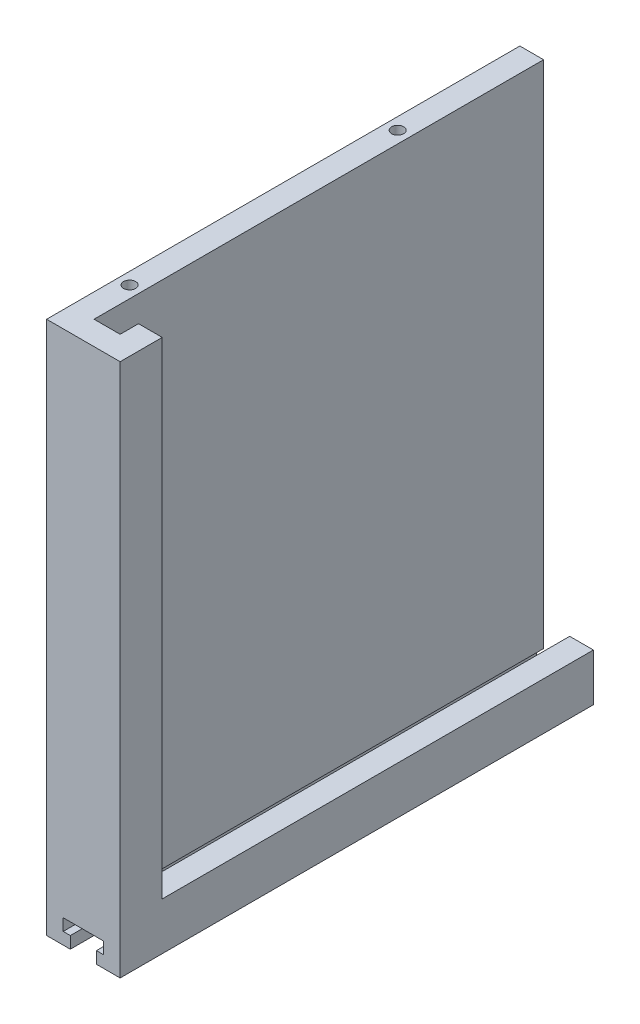
ISO-10303-21;
HEADER;
FILE_DESCRIPTION(('STEP AP214'),'2;1');
FILE_NAME('part.step','',(''),(''),'','','');
FILE_SCHEMA(('AUTOMOTIVE_DESIGN { 1 0 10303 214 1 1 1 1 }'));
ENDSEC;
DATA;
#1=APPLICATION_CONTEXT('core data for automotive mechanical design processes');
#2=APPLICATION_PROTOCOL_DEFINITION('international standard','automotive_design',2000,#1);
#3=PRODUCT_CONTEXT('',#1,'mechanical');
#4=PRODUCT('Part','Part','',(#3));
#5=PRODUCT_RELATED_PRODUCT_CATEGORY('part','',(#4));
#6=PRODUCT_DEFINITION_FORMATION('','',#4);
#7=PRODUCT_DEFINITION_CONTEXT('part definition',#1,'design');
#8=PRODUCT_DEFINITION('design','',#6,#7);
#9=PRODUCT_DEFINITION_SHAPE('','',#8);
#10=(LENGTH_UNIT() NAMED_UNIT(*) SI_UNIT(.MILLI.,.METRE.));
#11=(NAMED_UNIT(*) PLANE_ANGLE_UNIT() SI_UNIT($,.RADIAN.));
#12=(NAMED_UNIT(*) SI_UNIT($,.STERADIAN.) SOLID_ANGLE_UNIT());
#13=UNCERTAINTY_MEASURE_WITH_UNIT(LENGTH_MEASURE(1.E-05),#10,'distance_accuracy_value','');
#14=(GEOMETRIC_REPRESENTATION_CONTEXT(3) GLOBAL_UNCERTAINTY_ASSIGNED_CONTEXT((#13)) GLOBAL_UNIT_ASSIGNED_CONTEXT((#10,
#11,#12)) REPRESENTATION_CONTEXT('',''));
#15=CARTESIAN_POINT('',(0.,0.,0.));
#16=DIRECTION('',(0.,0.,1.));
#17=DIRECTION('',(1.,0.,0.));
#18=AXIS2_PLACEMENT_3D('',#15,#16,#17);
#19=CARTESIAN_POINT('',(10.,-225.,-199.5));
#20=DIRECTION('',(0.,1.,0.));
#21=DIRECTION('',(0.,0.,1.));
#22=AXIS2_PLACEMENT_3D('',#19,#20,#21);
#23=PLANE('',#22);
#24=DIRECTION('',(0.,0.,-1.));
#25=VECTOR('',#24,1.);
#26=CARTESIAN_POINT('',(0.,-225.,-199.5));
#27=LINE('',#26,#25);
#28=CARTESIAN_POINT('',(0.,-225.,199.5));
#29=VERTEX_POINT('',#28);
#30=CARTESIAN_POINT('',(0.,-225.,0.));
#31=VERTEX_POINT('',#30);
#32=EDGE_CURVE('E204',#29,#31,#27,.T.);
#33=ORIENTED_EDGE('',*,*,#32,.T.);
#34=DIRECTION('',(1.,0.,0.));
#35=VECTOR('',#34,1.);
#36=CARTESIAN_POINT('',(0.,-225.,0.));
#37=LINE('',#36,#35);
#38=CARTESIAN_POINT('',(10.,-225.,0.));
#39=VERTEX_POINT('',#38);
#40=EDGE_CURVE('E169',#31,#39,#37,.T.);
#41=ORIENTED_EDGE('',*,*,#40,.T.);
#42=DIRECTION('',(0.,0.,1.));
#43=VECTOR('',#42,1.);
#44=CARTESIAN_POINT('',(10.,-225.,-189.5));
#45=LINE('',#44,#43);
#46=CARTESIAN_POINT('',(10.,-225.,199.5));
#47=VERTEX_POINT('',#46);
#48=EDGE_CURVE('E241',#39,#47,#45,.T.);
#49=ORIENTED_EDGE('',*,*,#48,.T.);
#50=DIRECTION('',(-1.,0.,0.));
#51=VECTOR('',#50,1.);
#52=CARTESIAN_POINT('',(10.,-225.,199.5));
#53=LINE('',#52,#51);
#54=EDGE_CURVE('E207',#47,#29,#53,.T.);
#55=ORIENTED_EDGE('',*,*,#54,.T.);
#56=EDGE_LOOP('',(#33,#41,#49,#55));
#57=FACE_BOUND('',#56,.T.);
#58=ADVANCED_FACE('F38',(#57),#23,.F.);
#59=CARTESIAN_POINT('',(0.,0.,-199.51));
#60=DIRECTION('',(0.,-1.,0.));
#61=DIRECTION('',(0.,0.,-1.));
#62=AXIS2_PLACEMENT_3D('',#59,#60,#61);
#63=PLANE('',#62);
#64=CARTESIAN_POINT('',(5.,0.,169.5));
#65=DIRECTION('',(0.,1.,0.));
#66=DIRECTION('',(0.,0.,1.));
#67=AXIS2_PLACEMENT_3D('',#64,#65,#66);
#68=CIRCLE('',#67,2.55);
#69=CARTESIAN_POINT('',(5.,0.,172.05));
#70=VERTEX_POINT('',#69);
#71=EDGE_CURVE('E287',#70,#70,#68,.T.);
#72=ORIENTED_EDGE('',*,*,#71,.F.);
#73=EDGE_LOOP('',(#72));
#74=FACE_BOUND('',#73,.T.);
#75=CARTESIAN_POINT('',(4.99999999999998,0.,56.5));
#76=DIRECTION('',(0.,1.,0.));
#77=DIRECTION('',(0.,0.,1.));
#78=AXIS2_PLACEMENT_3D('',#75,#76,#77);
#79=CIRCLE('',#78,2.55);
#80=CARTESIAN_POINT('',(4.99999999999998,0.,59.05));
#81=VERTEX_POINT('',#80);
#82=EDGE_CURVE('E284',#81,#81,#79,.T.);
#83=ORIENTED_EDGE('',*,*,#82,.F.);
#84=EDGE_LOOP('',(#83));
#85=FACE_BOUND('',#84,.T.);
#86=DIRECTION('',(0.,0.,1.));
#87=VECTOR('',#86,1.);
#88=CARTESIAN_POINT('',(10.,0.,0.));
#89=LINE('',#88,#87);
#90=CARTESIAN_POINT('',(10.,0.,0.));
#91=VERTEX_POINT('',#90);
#92=CARTESIAN_POINT('',(10.,0.,189.5));
#93=VERTEX_POINT('',#92);
#94=EDGE_CURVE('E210',#91,#93,#89,.T.);
#95=ORIENTED_EDGE('',*,*,#94,.F.);
#96=DIRECTION('',(-1.,0.,0.));
#97=VECTOR('',#96,1.);
#98=CARTESIAN_POINT('',(0.,0.,0.));
#99=LINE('',#98,#97);
#100=CARTESIAN_POINT('',(0.,0.,0.));
#101=VERTEX_POINT('',#100);
#102=EDGE_CURVE('E168',#91,#101,#99,.T.);
#103=ORIENTED_EDGE('',*,*,#102,.T.);
#104=DIRECTION('',(0.,0.,1.));
#105=VECTOR('',#104,1.);
#106=CARTESIAN_POINT('',(0.,0.,0.));
#107=LINE('',#106,#105);
#108=CARTESIAN_POINT('',(0.,0.,199.5));
#109=VERTEX_POINT('',#108);
#110=EDGE_CURVE('E214',#101,#109,#107,.T.);
#111=ORIENTED_EDGE('',*,*,#110,.T.);
#112=DIRECTION('',(-1.,0.,0.));
#113=VECTOR('',#112,1.);
#114=CARTESIAN_POINT('',(10.,0.,199.5));
#115=LINE('',#114,#113);
#116=CARTESIAN_POINT('',(31.,0.,199.5));
#117=VERTEX_POINT('',#116);
#118=EDGE_CURVE('E213',#117,#109,#115,.T.);
#119=ORIENTED_EDGE('',*,*,#118,.F.);
#120=DIRECTION('',(0.,0.,1.));
#121=VECTOR('',#120,1.);
#122=CARTESIAN_POINT('',(31.,0.,0.));
#123=LINE('',#122,#121);
#124=CARTESIAN_POINT('',(31.,0.,181.766666666667));
#125=VERTEX_POINT('',#124);
#126=EDGE_CURVE('E211',#125,#117,#123,.T.);
#127=ORIENTED_EDGE('',*,*,#126,.F.);
#128=DIRECTION('',(-1.,0.,0.));
#129=VECTOR('',#128,1.);
#130=CARTESIAN_POINT('',(31.,0.,181.766666666667));
#131=LINE('',#130,#129);
#132=CARTESIAN_POINT('',(21.,0.,181.766666666667));
#133=VERTEX_POINT('',#132);
#134=EDGE_CURVE('E222',#125,#133,#131,.T.);
#135=ORIENTED_EDGE('',*,*,#134,.T.);
#136=DIRECTION('',(0.,0.,1.));
#137=VECTOR('',#136,1.);
#138=CARTESIAN_POINT('',(21.,0.,0.));
#139=LINE('',#138,#137);
#140=CARTESIAN_POINT('',(21.,0.,189.5));
#141=VERTEX_POINT('',#140);
#142=EDGE_CURVE('E216',#133,#141,#139,.T.);
#143=ORIENTED_EDGE('',*,*,#142,.T.);
#144=DIRECTION('',(-1.,0.,0.));
#145=VECTOR('',#144,1.);
#146=CARTESIAN_POINT('',(21.,0.,189.5));
#147=LINE('',#146,#145);
#148=EDGE_CURVE('E46',#141,#93,#147,.T.);
#149=ORIENTED_EDGE('',*,*,#148,.T.);
#150=EDGE_LOOP('',(#95,#103,#111,#119,#127,#135,#143,#149));
#151=FACE_BOUND('',#150,.T.);
#152=ADVANCED_FACE('F40',(#74,#85,#151),#63,.F.);
#153=CARTESIAN_POINT('',(10.,-225.,199.5));
#154=DIRECTION('',(0.,0.,-1.));
#155=DIRECTION('',(-1.,0.,0.));
#156=AXIS2_PLACEMENT_3D('',#153,#154,#155);
#157=PLANE('',#156);
#158=DIRECTION('',(0.,-1.,0.));
#159=VECTOR('',#158,1.);
#160=CARTESIAN_POINT('',(31.,-225.,199.5));
#161=LINE('',#160,#159);
#162=CARTESIAN_POINT('',(31.,-225.,199.5));
#163=VERTEX_POINT('',#162);
#164=EDGE_CURVE('E182',#117,#163,#161,.T.);
#165=ORIENTED_EDGE('',*,*,#164,.F.);
#166=ORIENTED_EDGE('',*,*,#118,.T.);
#167=DIRECTION('',(0.,-1.,0.));
#168=VECTOR('',#167,1.);
#169=CARTESIAN_POINT('',(0.,-225.,199.5));
#170=LINE('',#169,#168);
#171=EDGE_CURVE('E202',#109,#29,#170,.T.);
#172=ORIENTED_EDGE('',*,*,#171,.T.);
#173=ORIENTED_EDGE('',*,*,#54,.F.);
#174=DIRECTION('',(0.,1.,0.));
#175=VECTOR('',#174,1.);
#176=CARTESIAN_POINT('',(9.99999999999992,0.,199.5));
#177=LINE('',#176,#175);
#178=CARTESIAN_POINT('',(10.,-220.,199.5));
#179=VERTEX_POINT('',#178);
#180=EDGE_CURVE('E254',#47,#179,#177,.T.);
#181=ORIENTED_EDGE('',*,*,#180,.T.);
#182=DIRECTION('',(-1.,0.,0.));
#183=VECTOR('',#182,1.);
#184=CARTESIAN_POINT('',(0.,-220.,199.5));
#185=LINE('',#184,#183);
#186=CARTESIAN_POINT('',(7.,-220.,199.5));
#187=VERTEX_POINT('',#186);
#188=EDGE_CURVE('E267',#179,#187,#185,.T.);
#189=ORIENTED_EDGE('',*,*,#188,.T.);
#190=DIRECTION('',(0.,1.,0.));
#191=VECTOR('',#190,1.);
#192=CARTESIAN_POINT('',(6.99999999999996,0.,199.5));
#193=LINE('',#192,#191);
#194=CARTESIAN_POINT('',(7.,-215.,199.5));
#195=VERTEX_POINT('',#194);
#196=EDGE_CURVE('E268',#187,#195,#193,.T.);
#197=ORIENTED_EDGE('',*,*,#196,.T.);
#198=DIRECTION('',(-1.,0.,0.));
#199=VECTOR('',#198,1.);
#200=CARTESIAN_POINT('',(0.,-215.,199.5));
#201=LINE('',#200,#199);
#202=CARTESIAN_POINT('',(24.,-215.,199.5));
#203=VERTEX_POINT('',#202);
#204=EDGE_CURVE('E271',#203,#195,#201,.T.);
#205=ORIENTED_EDGE('',*,*,#204,.F.);
#206=DIRECTION('',(0.,1.,0.));
#207=VECTOR('',#206,1.);
#208=CARTESIAN_POINT('',(24.,0.,199.5));
#209=LINE('',#208,#207);
#210=CARTESIAN_POINT('',(24.,-220.,199.5));
#211=VERTEX_POINT('',#210);
#212=EDGE_CURVE('E274',#211,#203,#209,.T.);
#213=ORIENTED_EDGE('',*,*,#212,.F.);
#214=CARTESIAN_POINT('',(21.,-220.,199.5));
#215=VERTEX_POINT('',#214);
#216=EDGE_CURVE('E277',#211,#215,#185,.T.);
#217=ORIENTED_EDGE('',*,*,#216,.T.);
#218=DIRECTION('',(0.,1.,0.));
#219=VECTOR('',#218,1.);
#220=CARTESIAN_POINT('',(21.,0.,199.5));
#221=LINE('',#220,#219);
#222=CARTESIAN_POINT('',(21.,-225.,199.5));
#223=VERTEX_POINT('',#222);
#224=EDGE_CURVE('E280',#223,#215,#221,.T.);
#225=ORIENTED_EDGE('',*,*,#224,.F.);
#226=EDGE_CURVE('E208',#163,#223,#53,.T.);
#227=ORIENTED_EDGE('',*,*,#226,.F.);
#228=EDGE_LOOP('',(#165,#166,#172,#173,#181,#189,#197,#205,#213,#217,#225,#227));
#229=FACE_BOUND('',#228,.T.);
#230=ADVANCED_FACE('F357',(#229),#157,.F.);
#231=DIRECTION('',(0.,0.,1.));
#232=VECTOR('',#231,1.);
#233=CARTESIAN_POINT('',(21.,-225.,-189.5));
#234=LINE('',#233,#232);
#235=CARTESIAN_POINT('',(21.,-225.,0.));
#236=VERTEX_POINT('',#235);
#237=EDGE_CURVE('E177',#236,#223,#234,.T.);
#238=ORIENTED_EDGE('',*,*,#237,.F.);
#239=CARTESIAN_POINT('',(31.,-225.,0.));
#240=VERTEX_POINT('',#239);
#241=EDGE_CURVE('E61',#236,#240,#37,.T.);
#242=ORIENTED_EDGE('',*,*,#241,.T.);
#243=DIRECTION('',(0.,0.,-1.));
#244=VECTOR('',#243,1.);
#245=CARTESIAN_POINT('',(31.,-225.,-199.5));
#246=LINE('',#245,#244);
#247=EDGE_CURVE('E176',#163,#240,#246,.T.);
#248=ORIENTED_EDGE('',*,*,#247,.F.);
#249=ORIENTED_EDGE('',*,*,#226,.T.);
#250=EDGE_LOOP('',(#238,#242,#248,#249));
#251=FACE_BOUND('',#250,.T.);
#252=ADVANCED_FACE('F174',(#251),#23,.F.);
#253=CARTESIAN_POINT('',(0.,0.,0.));
#254=DIRECTION('',(-1.,0.,0.));
#255=DIRECTION('',(0.,0.,1.));
#256=AXIS2_PLACEMENT_3D('',#253,#254,#255);
#257=PLANE('',#256);
#258=DIRECTION('',(0.,-1.,0.));
#259=VECTOR('',#258,1.);
#260=CARTESIAN_POINT('',(0.,-225.,0.));
#261=LINE('',#260,#259);
#262=EDGE_CURVE('E315',#101,#31,#261,.T.);
#263=ORIENTED_EDGE('',*,*,#262,.T.);
#264=ORIENTED_EDGE('',*,*,#32,.F.);
#265=ORIENTED_EDGE('',*,*,#171,.F.);
#266=ORIENTED_EDGE('',*,*,#110,.F.);
#267=EDGE_LOOP('',(#263,#264,#265,#266));
#268=FACE_BOUND('',#267,.T.);
#269=ADVANCED_FACE('F362',(#268),#257,.T.);
#270=CARTESIAN_POINT('',(21.,0.,0.));
#271=DIRECTION('',(-1.,0.,0.));
#272=DIRECTION('',(0.,0.,1.));
#273=AXIS2_PLACEMENT_3D('',#270,#271,#272);
#274=PLANE('',#273);
#275=DIRECTION('',(0.,1.,0.));
#276=VECTOR('',#275,1.);
#277=CARTESIAN_POINT('',(21.,0.,0.));
#278=LINE('',#277,#276);
#279=CARTESIAN_POINT('',(21.,-215.,0.));
#280=VERTEX_POINT('',#279);
#281=CARTESIAN_POINT('',(21.,-205.,0.));
#282=VERTEX_POINT('',#281);
#283=EDGE_CURVE('E305',#280,#282,#278,.T.);
#284=ORIENTED_EDGE('',*,*,#283,.F.);
#285=DIRECTION('',(0.,0.,-1.));
#286=VECTOR('',#285,1.);
#287=CARTESIAN_POINT('',(21.,-215.,-189.5));
#288=LINE('',#287,#286);
#289=CARTESIAN_POINT('',(21.,-215.,189.5));
#290=VERTEX_POINT('',#289);
#291=EDGE_CURVE('E194',#290,#280,#288,.T.);
#292=ORIENTED_EDGE('',*,*,#291,.F.);
#293=DIRECTION('',(0.,-1.,0.));
#294=VECTOR('',#293,1.);
#295=CARTESIAN_POINT('',(21.,-215.,189.5));
#296=LINE('',#295,#294);
#297=EDGE_CURVE('E192',#141,#290,#296,.T.);
#298=ORIENTED_EDGE('',*,*,#297,.F.);
#299=ORIENTED_EDGE('',*,*,#142,.F.);
#300=DIRECTION('',(0.,-1.,0.));
#301=VECTOR('',#300,1.);
#302=CARTESIAN_POINT('',(21.,-205.,181.766666666667));
#303=LINE('',#302,#301);
#304=CARTESIAN_POINT('',(21.,-205.,181.766666666667));
#305=VERTEX_POINT('',#304);
#306=EDGE_CURVE('E234',#133,#305,#303,.T.);
#307=ORIENTED_EDGE('',*,*,#306,.T.);
#308=DIRECTION('',(0.,0.,-1.));
#309=VECTOR('',#308,1.);
#310=CARTESIAN_POINT('',(21.,-205.,-181.766666666667));
#311=LINE('',#310,#309);
#312=EDGE_CURVE('E240',#305,#282,#311,.T.);
#313=ORIENTED_EDGE('',*,*,#312,.T.);
#314=EDGE_LOOP('',(#284,#292,#298,#299,#307,#313));
#315=FACE_BOUND('',#314,.T.);
#316=ADVANCED_FACE('F366',(#315),#274,.T.);
#317=CARTESIAN_POINT('',(31.,0.,0.));
#318=DIRECTION('',(-1.,0.,0.));
#319=DIRECTION('',(0.,0.,1.));
#320=AXIS2_PLACEMENT_3D('',#317,#318,#319);
#321=PLANE('',#320);
#322=ORIENTED_EDGE('',*,*,#247,.T.);
#323=DIRECTION('',(0.,1.,0.));
#324=VECTOR('',#323,1.);
#325=CARTESIAN_POINT('',(31.,-225.,0.));
#326=LINE('',#325,#324);
#327=CARTESIAN_POINT('',(31.,-205.,0.));
#328=VERTEX_POINT('',#327);
#329=EDGE_CURVE('E160',#240,#328,#326,.T.);
#330=ORIENTED_EDGE('',*,*,#329,.T.);
#331=DIRECTION('',(0.,0.,-1.));
#332=VECTOR('',#331,1.);
#333=CARTESIAN_POINT('',(31.,-205.,-181.766666666667));
#334=LINE('',#333,#332);
#335=CARTESIAN_POINT('',(31.,-205.,181.766666666667));
#336=VERTEX_POINT('',#335);
#337=EDGE_CURVE('E248',#336,#328,#334,.T.);
#338=ORIENTED_EDGE('',*,*,#337,.F.);
#339=DIRECTION('',(0.,-1.,0.));
#340=VECTOR('',#339,1.);
#341=CARTESIAN_POINT('',(31.,-205.,181.766666666667));
#342=LINE('',#341,#340);
#343=EDGE_CURVE('E243',#125,#336,#342,.T.);
#344=ORIENTED_EDGE('',*,*,#343,.F.);
#345=ORIENTED_EDGE('',*,*,#126,.T.);
#346=ORIENTED_EDGE('',*,*,#164,.T.);
#347=EDGE_LOOP('',(#322,#330,#338,#344,#345,#346));
#348=FACE_BOUND('',#347,.T.);
#349=ADVANCED_FACE('F180',(#348),#321,.F.);
#350=CARTESIAN_POINT('',(31.,-205.,181.766666666667));
#351=DIRECTION('',(0.,0.,-1.));
#352=DIRECTION('',(-1.,0.,0.));
#353=AXIS2_PLACEMENT_3D('',#350,#351,#352);
#354=PLANE('',#353);
#355=ORIENTED_EDGE('',*,*,#134,.F.);
#356=ORIENTED_EDGE('',*,*,#343,.T.);
#357=DIRECTION('',(-1.,0.,0.));
#358=VECTOR('',#357,1.);
#359=CARTESIAN_POINT('',(31.,-205.,181.766666666667));
#360=LINE('',#359,#358);
#361=EDGE_CURVE('E188',#336,#305,#360,.T.);
#362=ORIENTED_EDGE('',*,*,#361,.T.);
#363=ORIENTED_EDGE('',*,*,#306,.F.);
#364=EDGE_LOOP('',(#355,#356,#362,#363));
#365=FACE_BOUND('',#364,.T.);
#366=ADVANCED_FACE('F235',(#365),#354,.T.);
#367=CARTESIAN_POINT('',(31.,-205.,-181.766666666667));
#368=DIRECTION('',(0.,1.,0.));
#369=DIRECTION('',(0.,0.,1.));
#370=AXIS2_PLACEMENT_3D('',#367,#368,#369);
#371=PLANE('',#370);
#372=DIRECTION('',(1.,0.,0.));
#373=VECTOR('',#372,1.);
#374=CARTESIAN_POINT('',(31.,-205.,0.));
#375=LINE('',#374,#373);
#376=EDGE_CURVE('E163',#282,#328,#375,.T.);
#377=ORIENTED_EDGE('',*,*,#376,.F.);
#378=ORIENTED_EDGE('',*,*,#312,.F.);
#379=ORIENTED_EDGE('',*,*,#361,.F.);
#380=ORIENTED_EDGE('',*,*,#337,.T.);
#381=EDGE_LOOP('',(#377,#378,#379,#380));
#382=FACE_BOUND('',#381,.T.);
#383=ADVANCED_FACE('F414',(#382),#371,.T.);
#384=CARTESIAN_POINT('',(10.,0.,0.));
#385=DIRECTION('',(-1.,0.,0.));
#386=DIRECTION('',(0.,0.,1.));
#387=AXIS2_PLACEMENT_3D('',#384,#385,#386);
#388=PLANE('',#387);
#389=DIRECTION('',(0.,0.,-1.));
#390=VECTOR('',#389,1.);
#391=CARTESIAN_POINT('',(10.,-215.,-189.5));
#392=LINE('',#391,#390);
#393=CARTESIAN_POINT('',(10.,-215.,189.5));
#394=VERTEX_POINT('',#393);
#395=CARTESIAN_POINT('',(10.,-215.,0.));
#396=VERTEX_POINT('',#395);
#397=EDGE_CURVE('E186',#394,#396,#392,.T.);
#398=ORIENTED_EDGE('',*,*,#397,.T.);
#399=DIRECTION('',(0.,1.,0.));
#400=VECTOR('',#399,1.);
#401=CARTESIAN_POINT('',(10.,0.,0.));
#402=LINE('',#401,#400);
#403=EDGE_CURVE('E293',#396,#91,#402,.T.);
#404=ORIENTED_EDGE('',*,*,#403,.T.);
#405=ORIENTED_EDGE('',*,*,#94,.T.);
#406=DIRECTION('',(0.,-1.,0.));
#407=VECTOR('',#406,1.);
#408=CARTESIAN_POINT('',(10.,-215.,189.5));
#409=LINE('',#408,#407);
#410=EDGE_CURVE('E184',#93,#394,#409,.T.);
#411=ORIENTED_EDGE('',*,*,#410,.T.);
#412=EDGE_LOOP('',(#398,#404,#405,#411));
#413=FACE_BOUND('',#412,.T.);
#414=ADVANCED_FACE('F417',(#413),#388,.F.);
#415=CARTESIAN_POINT('',(21.,-215.,189.5));
#416=DIRECTION('',(0.,0.,-1.));
#417=DIRECTION('',(-1.,0.,0.));
#418=AXIS2_PLACEMENT_3D('',#415,#416,#417);
#419=PLANE('',#418);
#420=ORIENTED_EDGE('',*,*,#148,.F.);
#421=ORIENTED_EDGE('',*,*,#297,.T.);
#422=DIRECTION('',(-1.,0.,0.));
#423=VECTOR('',#422,1.);
#424=CARTESIAN_POINT('',(21.,-215.,189.5));
#425=LINE('',#424,#423);
#426=EDGE_CURVE('E196',#290,#394,#425,.T.);
#427=ORIENTED_EDGE('',*,*,#426,.T.);
#428=ORIENTED_EDGE('',*,*,#410,.F.);
#429=EDGE_LOOP('',(#420,#421,#427,#428));
#430=FACE_BOUND('',#429,.T.);
#431=ADVANCED_FACE('F409',(#430),#419,.T.);
#432=CARTESIAN_POINT('',(0.,-215.,-189.5));
#433=DIRECTION('',(0.,1.,0.));
#434=DIRECTION('',(0.,0.,1.));
#435=AXIS2_PLACEMENT_3D('',#432,#433,#434);
#436=PLANE('',#435);
#437=DIRECTION('',(0.,0.,1.));
#438=VECTOR('',#437,1.);
#439=CARTESIAN_POINT('',(7.,-215.,-189.5));
#440=LINE('',#439,#438);
#441=CARTESIAN_POINT('',(7.,-215.,0.));
#442=VERTEX_POINT('',#441);
#443=EDGE_CURVE('E260',#442,#195,#440,.T.);
#444=ORIENTED_EDGE('',*,*,#443,.F.);
#445=DIRECTION('',(1.,0.,0.));
#446=VECTOR('',#445,1.);
#447=CARTESIAN_POINT('',(0.,-215.,0.));
#448=LINE('',#447,#446);
#449=EDGE_CURVE('E53',#442,#396,#448,.T.);
#450=ORIENTED_EDGE('',*,*,#449,.T.);
#451=ORIENTED_EDGE('',*,*,#397,.F.);
#452=ORIENTED_EDGE('',*,*,#426,.F.);
#453=ORIENTED_EDGE('',*,*,#291,.T.);
#454=CARTESIAN_POINT('',(24.,-215.,0.));
#455=VERTEX_POINT('',#454);
#456=EDGE_CURVE('E307',#280,#455,#448,.T.);
#457=ORIENTED_EDGE('',*,*,#456,.T.);
#458=DIRECTION('',(0.,0.,1.));
#459=VECTOR('',#458,1.);
#460=CARTESIAN_POINT('',(24.,-215.,-189.5));
#461=LINE('',#460,#459);
#462=EDGE_CURVE('E258',#455,#203,#461,.T.);
#463=ORIENTED_EDGE('',*,*,#462,.T.);
#464=ORIENTED_EDGE('',*,*,#204,.T.);
#465=EDGE_LOOP('',(#444,#450,#451,#452,#453,#457,#463,#464));
#466=FACE_BOUND('',#465,.T.);
#467=ADVANCED_FACE('F397',(#466),#436,.F.);
#468=CARTESIAN_POINT('',(9.99999999999992,0.,-189.5));
#469=DIRECTION('',(1.,0.,0.));
#470=DIRECTION('',(0.,1.,0.));
#471=AXIS2_PLACEMENT_3D('',#468,#469,#470);
#472=PLANE('',#471);
#473=DIRECTION('',(0.,-1.,0.));
#474=VECTOR('',#473,1.);
#475=CARTESIAN_POINT('',(9.99999999999992,0.,0.));
#476=LINE('',#475,#474);
#477=CARTESIAN_POINT('',(10.,-220.,0.));
#478=VERTEX_POINT('',#477);
#479=EDGE_CURVE('E298',#478,#39,#476,.T.);
#480=ORIENTED_EDGE('',*,*,#479,.F.);
#481=DIRECTION('',(0.,0.,1.));
#482=VECTOR('',#481,1.);
#483=CARTESIAN_POINT('',(10.,-220.,-189.5));
#484=LINE('',#483,#482);
#485=EDGE_CURVE('E245',#478,#179,#484,.T.);
#486=ORIENTED_EDGE('',*,*,#485,.T.);
#487=ORIENTED_EDGE('',*,*,#180,.F.);
#488=ORIENTED_EDGE('',*,*,#48,.F.);
#489=EDGE_LOOP('',(#480,#486,#487,#488));
#490=FACE_BOUND('',#489,.T.);
#491=ADVANCED_FACE('F393',(#490),#472,.T.);
#492=CARTESIAN_POINT('',(0.,-220.,-189.5));
#493=DIRECTION('',(0.,1.,0.));
#494=DIRECTION('',(0.,0.,1.));
#495=AXIS2_PLACEMENT_3D('',#492,#493,#494);
#496=PLANE('',#495);
#497=DIRECTION('',(1.,0.,0.));
#498=VECTOR('',#497,1.);
#499=CARTESIAN_POINT('',(0.,-220.,0.));
#500=LINE('',#499,#498);
#501=CARTESIAN_POINT('',(7.,-220.,0.));
#502=VERTEX_POINT('',#501);
#503=EDGE_CURVE('E300',#502,#478,#500,.T.);
#504=ORIENTED_EDGE('',*,*,#503,.F.);
#505=DIRECTION('',(0.,0.,1.));
#506=VECTOR('',#505,1.);
#507=CARTESIAN_POINT('',(7.,-220.,-189.5));
#508=LINE('',#507,#506);
#509=EDGE_CURVE('E262',#502,#187,#508,.T.);
#510=ORIENTED_EDGE('',*,*,#509,.T.);
#511=ORIENTED_EDGE('',*,*,#188,.F.);
#512=ORIENTED_EDGE('',*,*,#485,.F.);
#513=EDGE_LOOP('',(#504,#510,#511,#512));
#514=FACE_BOUND('',#513,.T.);
#515=ADVANCED_FACE('F396',(#514),#496,.T.);
#516=CARTESIAN_POINT('',(6.99999999999996,0.,-189.5));
#517=DIRECTION('',(1.,0.,0.));
#518=DIRECTION('',(0.,1.,0.));
#519=AXIS2_PLACEMENT_3D('',#516,#517,#518);
#520=PLANE('',#519);
#521=DIRECTION('',(0.,-1.,0.));
#522=VECTOR('',#521,1.);
#523=CARTESIAN_POINT('',(6.99999999999996,0.,0.));
#524=LINE('',#523,#522);
#525=EDGE_CURVE('E302',#442,#502,#524,.T.);
#526=ORIENTED_EDGE('',*,*,#525,.F.);
#527=ORIENTED_EDGE('',*,*,#443,.T.);
#528=ORIENTED_EDGE('',*,*,#196,.F.);
#529=ORIENTED_EDGE('',*,*,#509,.F.);
#530=EDGE_LOOP('',(#526,#527,#528,#529));
#531=FACE_BOUND('',#530,.T.);
#532=ADVANCED_FACE('F401',(#531),#520,.T.);
#533=CARTESIAN_POINT('',(24.,0.,-189.5));
#534=DIRECTION('',(1.,0.,0.));
#535=DIRECTION('',(0.,0.,-1.));
#536=AXIS2_PLACEMENT_3D('',#533,#534,#535);
#537=PLANE('',#536);
#538=ORIENTED_EDGE('',*,*,#462,.F.);
#539=DIRECTION('',(0.,-1.,0.));
#540=VECTOR('',#539,1.);
#541=CARTESIAN_POINT('',(24.,0.,0.));
#542=LINE('',#541,#540);
#543=CARTESIAN_POINT('',(24.,-220.,0.));
#544=VERTEX_POINT('',#543);
#545=EDGE_CURVE('E310',#455,#544,#542,.T.);
#546=ORIENTED_EDGE('',*,*,#545,.T.);
#547=DIRECTION('',(0.,0.,1.));
#548=VECTOR('',#547,1.);
#549=CARTESIAN_POINT('',(24.,-220.,-189.5));
#550=LINE('',#549,#548);
#551=EDGE_CURVE('E256',#544,#211,#550,.T.);
#552=ORIENTED_EDGE('',*,*,#551,.T.);
#553=ORIENTED_EDGE('',*,*,#212,.T.);
#554=EDGE_LOOP('',(#538,#546,#552,#553));
#555=FACE_BOUND('',#554,.T.);
#556=ADVANCED_FACE('F405',(#555),#537,.F.);
#557=DIRECTION('',(1.,0.,0.));
#558=VECTOR('',#557,1.);
#559=CARTESIAN_POINT('',(0.,-220.,0.));
#560=LINE('',#559,#558);
#561=CARTESIAN_POINT('',(21.,-220.,0.));
#562=VERTEX_POINT('',#561);
#563=EDGE_CURVE('E313',#562,#544,#560,.T.);
#564=ORIENTED_EDGE('',*,*,#563,.F.);
#565=DIRECTION('',(0.,0.,1.));
#566=VECTOR('',#565,1.);
#567=CARTESIAN_POINT('',(21.,-220.,-189.5));
#568=LINE('',#567,#566);
#569=EDGE_CURVE('E253',#562,#215,#568,.T.);
#570=ORIENTED_EDGE('',*,*,#569,.T.);
#571=ORIENTED_EDGE('',*,*,#216,.F.);
#572=ORIENTED_EDGE('',*,*,#551,.F.);
#573=EDGE_LOOP('',(#564,#570,#571,#572));
#574=FACE_BOUND('',#573,.T.);
#575=ADVANCED_FACE('F386',(#574),#496,.T.);
#576=CARTESIAN_POINT('',(21.,0.,-189.5));
#577=DIRECTION('',(1.,0.,0.));
#578=DIRECTION('',(0.,0.,-1.));
#579=AXIS2_PLACEMENT_3D('',#576,#577,#578);
#580=PLANE('',#579);
#581=ORIENTED_EDGE('',*,*,#569,.F.);
#582=DIRECTION('',(0.,-1.,0.));
#583=VECTOR('',#582,1.);
#584=CARTESIAN_POINT('',(21.,0.,0.));
#585=LINE('',#584,#583);
#586=EDGE_CURVE('E11',#562,#236,#585,.T.);
#587=ORIENTED_EDGE('',*,*,#586,.T.);
#588=ORIENTED_EDGE('',*,*,#237,.T.);
#589=ORIENTED_EDGE('',*,*,#224,.T.);
#590=EDGE_LOOP('',(#581,#587,#588,#589));
#591=FACE_BOUND('',#590,.T.);
#592=ADVANCED_FACE('F359',(#591),#580,.F.);
#593=CARTESIAN_POINT('',(4.99999999999998,-15.,56.5));
#594=DIRECTION('',(0.,1.,0.));
#595=DIRECTION('',(0.,0.,1.));
#596=AXIS2_PLACEMENT_3D('',#593,#594,#595);
#597=CYLINDRICAL_SURFACE('',#596,2.55);
#598=CARTESIAN_POINT('',(4.99999999999998,-15.,56.5));
#599=DIRECTION('',(0.,1.,0.));
#600=DIRECTION('',(0.,0.,1.));
#601=AXIS2_PLACEMENT_3D('',#598,#599,#600);
#602=CIRCLE('',#601,2.55);
#603=CARTESIAN_POINT('',(4.99999999999998,-15.,59.05));
#604=VERTEX_POINT('',#603);
#605=EDGE_CURVE('E283',#604,#604,#602,.T.);
#606=ORIENTED_EDGE('',*,*,#605,.F.);
#607=EDGE_LOOP('',(#606));
#608=FACE_BOUND('',#607,.T.);
#609=ORIENTED_EDGE('',*,*,#82,.T.);
#610=EDGE_LOOP('',(#609));
#611=FACE_BOUND('',#610,.T.);
#612=ADVANCED_FACE('F370',(#608,#611),#597,.F.);
#613=CARTESIAN_POINT('',(4.99999999999998,-15.,56.5));
#614=DIRECTION('',(0.,1.,0.));
#615=DIRECTION('',(0.,0.,1.));
#616=AXIS2_PLACEMENT_3D('',#613,#614,#615);
#617=PLANE('',#616);
#618=ORIENTED_EDGE('',*,*,#605,.T.);
#619=EDGE_LOOP('',(#618));
#620=FACE_BOUND('',#619,.T.);
#621=ADVANCED_FACE('F375',(#620),#617,.T.);
#622=CARTESIAN_POINT('',(5.,-15.,169.5));
#623=DIRECTION('',(0.,1.,0.));
#624=DIRECTION('',(0.,0.,1.));
#625=AXIS2_PLACEMENT_3D('',#622,#623,#624);
#626=CYLINDRICAL_SURFACE('',#625,2.55);
#627=CARTESIAN_POINT('',(5.,-15.,169.5));
#628=DIRECTION('',(0.,1.,0.));
#629=DIRECTION('',(0.,0.,1.));
#630=AXIS2_PLACEMENT_3D('',#627,#628,#629);
#631=CIRCLE('',#630,2.55);
#632=CARTESIAN_POINT('',(5.,-15.,172.05));
#633=VERTEX_POINT('',#632);
#634=EDGE_CURVE('E290',#633,#633,#631,.T.);
#635=ORIENTED_EDGE('',*,*,#634,.F.);
#636=EDGE_LOOP('',(#635));
#637=FACE_BOUND('',#636,.T.);
#638=ORIENTED_EDGE('',*,*,#71,.T.);
#639=EDGE_LOOP('',(#638));
#640=FACE_BOUND('',#639,.T.);
#641=ADVANCED_FACE('F382',(#637,#640),#626,.F.);
#642=CARTESIAN_POINT('',(5.,-15.,169.5));
#643=DIRECTION('',(0.,1.,0.));
#644=DIRECTION('',(0.,0.,1.));
#645=AXIS2_PLACEMENT_3D('',#642,#643,#644);
#646=PLANE('',#645);
#647=ORIENTED_EDGE('',*,*,#634,.T.);
#648=EDGE_LOOP('',(#647));
#649=FACE_BOUND('',#648,.T.);
#650=ADVANCED_FACE('F476',(#649),#646,.T.);
#651=CARTESIAN_POINT('',(0.,0.,0.));
#652=DIRECTION('',(0.,0.,1.));
#653=DIRECTION('',(1.,0.,0.));
#654=AXIS2_PLACEMENT_3D('',#651,#652,#653);
#655=PLANE('',#654);
#656=CARTESIAN_POINT('',(26.,-210.,0.));
#657=DIRECTION('',(0.,0.,1.));
#658=DIRECTION('',(1.,0.,0.));
#659=AXIS2_PLACEMENT_3D('',#656,#657,#658);
#660=CIRCLE('',#659,2.54999999999999);
#661=CARTESIAN_POINT('',(28.55,-210.,0.));
#662=VERTEX_POINT('',#661);
#663=EDGE_CURVE('E333',#662,#662,#660,.T.);
#664=ORIENTED_EDGE('',*,*,#663,.T.);
#665=EDGE_LOOP('',(#664));
#666=FACE_BOUND('',#665,.T.);
#667=ORIENTED_EDGE('',*,*,#376,.T.);
#668=ORIENTED_EDGE('',*,*,#329,.F.);
#669=ORIENTED_EDGE('',*,*,#241,.F.);
#670=ORIENTED_EDGE('',*,*,#586,.F.);
#671=ORIENTED_EDGE('',*,*,#563,.T.);
#672=ORIENTED_EDGE('',*,*,#545,.F.);
#673=ORIENTED_EDGE('',*,*,#456,.F.);
#674=ORIENTED_EDGE('',*,*,#283,.T.);
#675=EDGE_LOOP('',(#667,#668,#669,#670,#671,#672,#673,#674));
#676=FACE_BOUND('',#675,.T.);
#677=ADVANCED_FACE('F161',(#666,#676),#655,.F.);
#678=CARTESIAN_POINT('',(5.,-30.,0.));
#679=DIRECTION('',(0.,0.,1.));
#680=DIRECTION('',(1.,0.,0.));
#681=AXIS2_PLACEMENT_3D('',#678,#679,#680);
#682=CIRCLE('',#681,2.55);
#683=CARTESIAN_POINT('',(7.55,-30.,0.));
#684=VERTEX_POINT('',#683);
#685=EDGE_CURVE('E330',#684,#684,#682,.T.);
#686=ORIENTED_EDGE('',*,*,#685,.T.);
#687=EDGE_LOOP('',(#686));
#688=FACE_BOUND('',#687,.T.);
#689=CARTESIAN_POINT('',(5.00000000000002,-195.,0.));
#690=DIRECTION('',(0.,0.,1.));
#691=DIRECTION('',(1.,0.,0.));
#692=AXIS2_PLACEMENT_3D('',#689,#690,#691);
#693=CIRCLE('',#692,2.54999999999999);
#694=CARTESIAN_POINT('',(7.55000000000002,-195.,0.));
#695=VERTEX_POINT('',#694);
#696=EDGE_CURVE('E324',#695,#695,#693,.T.);
#697=ORIENTED_EDGE('',*,*,#696,.T.);
#698=EDGE_LOOP('',(#697));
#699=FACE_BOUND('',#698,.T.);
#700=ORIENTED_EDGE('',*,*,#449,.F.);
#701=ORIENTED_EDGE('',*,*,#525,.T.);
#702=ORIENTED_EDGE('',*,*,#503,.T.);
#703=ORIENTED_EDGE('',*,*,#479,.T.);
#704=ORIENTED_EDGE('',*,*,#40,.F.);
#705=ORIENTED_EDGE('',*,*,#262,.F.);
#706=ORIENTED_EDGE('',*,*,#102,.F.);
#707=ORIENTED_EDGE('',*,*,#403,.F.);
#708=EDGE_LOOP('',(#700,#701,#702,#703,#704,#705,#706,#707));
#709=FACE_BOUND('',#708,.T.);
#710=ADVANCED_FACE('F444',(#688,#699,#709),#655,.F.);
#711=CARTESIAN_POINT('',(5.00000000000002,-195.,15.));
#712=DIRECTION('',(0.,0.,-1.));
#713=DIRECTION('',(-1.,0.,0.));
#714=AXIS2_PLACEMENT_3D('',#711,#712,#713);
#715=CYLINDRICAL_SURFACE('',#714,2.54999999999999);
#716=CARTESIAN_POINT('',(5.00000000000002,-195.,15.));
#717=DIRECTION('',(0.,0.,1.));
#718=DIRECTION('',(1.,0.,0.));
#719=AXIS2_PLACEMENT_3D('',#716,#717,#718);
#720=CIRCLE('',#719,2.54999999999999);
#721=CARTESIAN_POINT('',(7.55000000000002,-195.,15.));
#722=VERTEX_POINT('',#721);
#723=EDGE_CURVE('E321',#722,#722,#720,.T.);
#724=ORIENTED_EDGE('',*,*,#723,.T.);
#725=EDGE_LOOP('',(#724));
#726=FACE_BOUND('',#725,.T.);
#727=ORIENTED_EDGE('',*,*,#696,.F.);
#728=EDGE_LOOP('',(#727));
#729=FACE_BOUND('',#728,.T.);
#730=ADVANCED_FACE('F486',(#726,#729),#715,.F.);
#731=CARTESIAN_POINT('',(5.00000000000002,-195.,15.));
#732=DIRECTION('',(0.,0.,1.));
#733=DIRECTION('',(1.,0.,0.));
#734=AXIS2_PLACEMENT_3D('',#731,#732,#733);
#735=PLANE('',#734);
#736=ORIENTED_EDGE('',*,*,#723,.F.);
#737=EDGE_LOOP('',(#736));
#738=FACE_BOUND('',#737,.T.);
#739=ADVANCED_FACE('F494',(#738),#735,.F.);
#740=CARTESIAN_POINT('',(5.,-30.,15.));
#741=DIRECTION('',(0.,0.,-1.));
#742=DIRECTION('',(-1.,0.,0.));
#743=AXIS2_PLACEMENT_3D('',#740,#741,#742);
#744=CYLINDRICAL_SURFACE('',#743,2.55);
#745=CARTESIAN_POINT('',(5.,-30.,15.));
#746=DIRECTION('',(0.,0.,1.));
#747=DIRECTION('',(1.,0.,0.));
#748=AXIS2_PLACEMENT_3D('',#745,#746,#747);
#749=CIRCLE('',#748,2.55);
#750=CARTESIAN_POINT('',(7.55,-30.,15.));
#751=VERTEX_POINT('',#750);
#752=EDGE_CURVE('E327',#751,#751,#749,.T.);
#753=ORIENTED_EDGE('',*,*,#752,.T.);
#754=EDGE_LOOP('',(#753));
#755=FACE_BOUND('',#754,.T.);
#756=ORIENTED_EDGE('',*,*,#685,.F.);
#757=EDGE_LOOP('',(#756));
#758=FACE_BOUND('',#757,.T.);
#759=ADVANCED_FACE('F503',(#755,#758),#744,.F.);
#760=CARTESIAN_POINT('',(5.,-30.,15.));
#761=DIRECTION('',(0.,0.,1.));
#762=DIRECTION('',(1.,0.,0.));
#763=AXIS2_PLACEMENT_3D('',#760,#761,#762);
#764=PLANE('',#763);
#765=ORIENTED_EDGE('',*,*,#752,.F.);
#766=EDGE_LOOP('',(#765));
#767=FACE_BOUND('',#766,.T.);
#768=ADVANCED_FACE('F348',(#767),#764,.F.);
#769=CARTESIAN_POINT('',(26.,-210.,15.));
#770=DIRECTION('',(0.,0.,-1.));
#771=DIRECTION('',(-1.,0.,0.));
#772=AXIS2_PLACEMENT_3D('',#769,#770,#771);
#773=CYLINDRICAL_SURFACE('',#772,2.54999999999999);
#774=CARTESIAN_POINT('',(26.,-210.,15.));
#775=DIRECTION('',(0.,0.,1.));
#776=DIRECTION('',(1.,0.,0.));
#777=AXIS2_PLACEMENT_3D('',#774,#775,#776);
#778=CIRCLE('',#777,2.54999999999999);
#779=CARTESIAN_POINT('',(28.55,-210.,15.));
#780=VERTEX_POINT('',#779);
#781=EDGE_CURVE('E178',#780,#780,#778,.T.);
#782=ORIENTED_EDGE('',*,*,#781,.T.);
#783=EDGE_LOOP('',(#782));
#784=FACE_BOUND('',#783,.T.);
#785=ORIENTED_EDGE('',*,*,#663,.F.);
#786=EDGE_LOOP('',(#785));
#787=FACE_BOUND('',#786,.T.);
#788=ADVANCED_FACE('F339',(#784,#787),#773,.F.);
#789=CARTESIAN_POINT('',(26.,-210.,15.));
#790=DIRECTION('',(0.,0.,1.));
#791=DIRECTION('',(1.,0.,0.));
#792=AXIS2_PLACEMENT_3D('',#789,#790,#791);
#793=PLANE('',#792);
#794=ORIENTED_EDGE('',*,*,#781,.F.);
#795=EDGE_LOOP('',(#794));
#796=FACE_BOUND('',#795,.T.);
#797=ADVANCED_FACE('F342',(#796),#793,.F.);
#798=CLOSED_SHELL('',(#58,#152,#230,#252,#269,#316,#349,#366,#383,#414,#431,#467,#491,#515,#532,
#556,#575,#592,#612,#621,#641,#650,#677,#710,#730,#739,#759,#768,#788,#797));
#799=MANIFOLD_SOLID_BREP('B2',#798);
#800=ADVANCED_BREP_SHAPE_REPRESENTATION('',(#18,#799),#14);
#801=SHAPE_DEFINITION_REPRESENTATION(#9,#800);
ENDSEC;
END-ISO-10303-21;
